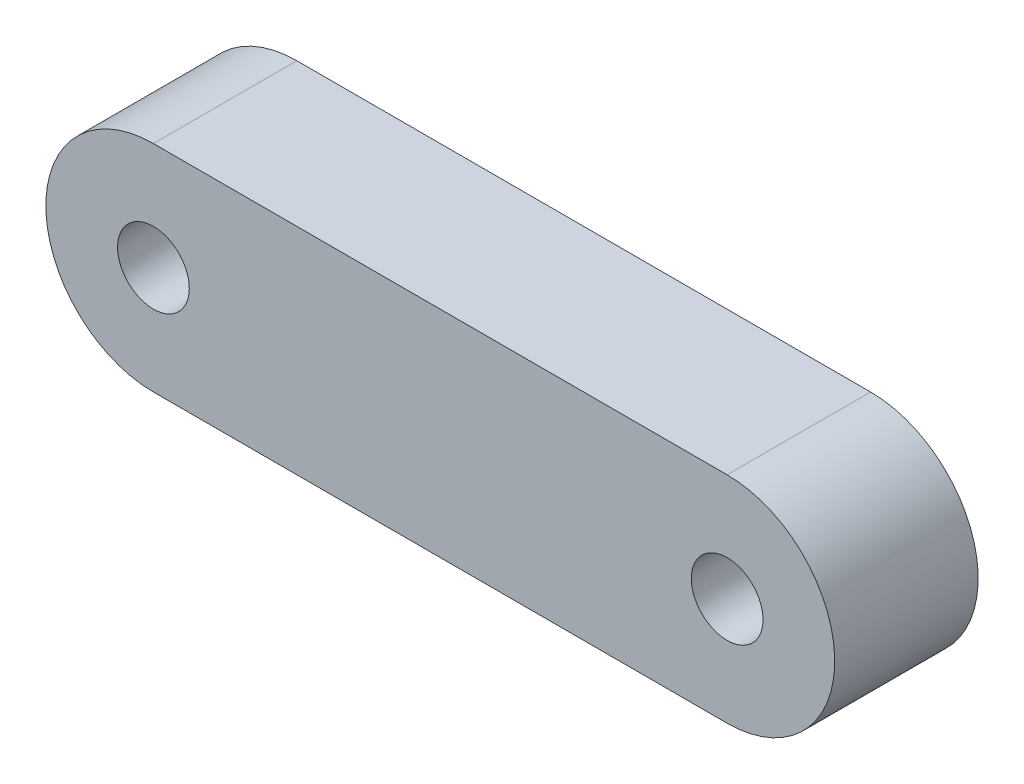
ISO-10303-21;
HEADER;
FILE_DESCRIPTION(('STEP AP214'),'2;1');
FILE_NAME('part.step','',(''),(''),'','','');
FILE_SCHEMA(('AUTOMOTIVE_DESIGN { 1 0 10303 214 1 1 1 1 }'));
ENDSEC;
DATA;
#1=APPLICATION_CONTEXT('core data for automotive mechanical design processes');
#2=APPLICATION_PROTOCOL_DEFINITION('international standard','automotive_design',2000,#1);
#3=PRODUCT_CONTEXT('',#1,'mechanical');
#4=PRODUCT('Part','Part','',(#3));
#5=PRODUCT_RELATED_PRODUCT_CATEGORY('part','',(#4));
#6=PRODUCT_DEFINITION_FORMATION('','',#4);
#7=PRODUCT_DEFINITION_CONTEXT('part definition',#1,'design');
#8=PRODUCT_DEFINITION('design','',#6,#7);
#9=PRODUCT_DEFINITION_SHAPE('','',#8);
#10=(LENGTH_UNIT() NAMED_UNIT(*) SI_UNIT(.MILLI.,.METRE.));
#11=(NAMED_UNIT(*) PLANE_ANGLE_UNIT() SI_UNIT($,.RADIAN.));
#12=(NAMED_UNIT(*) SI_UNIT($,.STERADIAN.) SOLID_ANGLE_UNIT());
#13=UNCERTAINTY_MEASURE_WITH_UNIT(LENGTH_MEASURE(1.E-05),#10,'distance_accuracy_value','');
#14=(GEOMETRIC_REPRESENTATION_CONTEXT(3) GLOBAL_UNCERTAINTY_ASSIGNED_CONTEXT((#13)) GLOBAL_UNIT_ASSIGNED_CONTEXT((#10,
#11,#12)) REPRESENTATION_CONTEXT('',''));
#15=CARTESIAN_POINT('',(0.,0.,0.));
#16=DIRECTION('',(0.,0.,1.));
#17=DIRECTION('',(1.,0.,0.));
#18=AXIS2_PLACEMENT_3D('',#15,#16,#17);
#19=CARTESIAN_POINT('',(0.,0.,20.));
#20=DIRECTION('',(0.,0.,1.));
#21=DIRECTION('',(1.,0.,0.));
#22=AXIS2_PLACEMENT_3D('',#19,#20,#21);
#23=PLANE('',#22);
#24=CARTESIAN_POINT('',(80.,0.,20.));
#25=DIRECTION('',(0.,0.,1.));
#26=DIRECTION('',(1.,0.,0.));
#27=AXIS2_PLACEMENT_3D('',#24,#25,#26);
#28=CIRCLE('',#27,4.99999999999999);
#29=CARTESIAN_POINT('',(85.,0.,20.));
#30=VERTEX_POINT('',#29);
#31=EDGE_CURVE('E103',#30,#30,#28,.T.);
#32=ORIENTED_EDGE('',*,*,#31,.F.);
#33=EDGE_LOOP('',(#32));
#34=FACE_BOUND('',#33,.T.);
#35=CARTESIAN_POINT('',(0.,0.,20.));
#36=DIRECTION('',(0.,0.,1.));
#37=DIRECTION('',(1.,0.,0.));
#38=AXIS2_PLACEMENT_3D('',#35,#36,#37);
#39=CIRCLE('',#38,15.);
#40=CARTESIAN_POINT('',(0.,15.,20.));
#41=VERTEX_POINT('',#40);
#42=CARTESIAN_POINT('',(0.,-15.,20.));
#43=VERTEX_POINT('',#42);
#44=EDGE_CURVE('E88',#41,#43,#39,.T.);
#45=ORIENTED_EDGE('',*,*,#44,.T.);
#46=DIRECTION('',(1.,0.,0.));
#47=VECTOR('',#46,1.);
#48=CARTESIAN_POINT('',(0.,-15.,20.));
#49=LINE('',#48,#47);
#50=CARTESIAN_POINT('',(80.,-15.,20.));
#51=VERTEX_POINT('',#50);
#52=EDGE_CURVE('E83',#43,#51,#49,.T.);
#53=ORIENTED_EDGE('',*,*,#52,.T.);
#54=CARTESIAN_POINT('',(80.,0.,20.));
#55=DIRECTION('',(0.,0.,1.));
#56=DIRECTION('',(1.,0.,0.));
#57=AXIS2_PLACEMENT_3D('',#54,#55,#56);
#58=CIRCLE('',#57,15.);
#59=CARTESIAN_POINT('',(80.,15.,20.));
#60=VERTEX_POINT('',#59);
#61=EDGE_CURVE('E86',#51,#60,#58,.T.);
#62=ORIENTED_EDGE('',*,*,#61,.T.);
#63=DIRECTION('',(-1.,0.,0.));
#64=VECTOR('',#63,1.);
#65=CARTESIAN_POINT('',(0.,15.,20.));
#66=LINE('',#65,#64);
#67=EDGE_CURVE('E53',#60,#41,#66,.T.);
#68=ORIENTED_EDGE('',*,*,#67,.T.);
#69=EDGE_LOOP('',(#45,#53,#62,#68));
#70=FACE_BOUND('',#69,.T.);
#71=CARTESIAN_POINT('',(0.,0.,20.));
#72=DIRECTION('',(0.,0.,1.));
#73=DIRECTION('',(1.,0.,0.));
#74=AXIS2_PLACEMENT_3D('',#71,#72,#73);
#75=CIRCLE('',#74,5.);
#76=CARTESIAN_POINT('',(5.,0.,20.));
#77=VERTEX_POINT('',#76);
#78=EDGE_CURVE('E118',#77,#77,#75,.T.);
#79=ORIENTED_EDGE('',*,*,#78,.F.);
#80=EDGE_LOOP('',(#79));
#81=FACE_BOUND('',#80,.T.);
#82=ADVANCED_FACE('F36',(#34,#70,#81),#23,.T.);
#83=CARTESIAN_POINT('',(0.,0.,0.));
#84=DIRECTION('',(0.,0.,1.));
#85=DIRECTION('',(1.,0.,0.));
#86=AXIS2_PLACEMENT_3D('',#83,#84,#85);
#87=PLANE('',#86);
#88=CARTESIAN_POINT('',(80.,0.,0.));
#89=DIRECTION('',(0.,0.,1.));
#90=DIRECTION('',(1.,0.,0.));
#91=AXIS2_PLACEMENT_3D('',#88,#89,#90);
#92=CIRCLE('',#91,4.99999999999999);
#93=CARTESIAN_POINT('',(85.,0.,0.));
#94=VERTEX_POINT('',#93);
#95=EDGE_CURVE('E115',#94,#94,#92,.T.);
#96=ORIENTED_EDGE('',*,*,#95,.T.);
#97=EDGE_LOOP('',(#96));
#98=FACE_BOUND('',#97,.T.);
#99=CARTESIAN_POINT('',(0.,0.,0.));
#100=DIRECTION('',(0.,0.,1.));
#101=DIRECTION('',(1.,0.,0.));
#102=AXIS2_PLACEMENT_3D('',#99,#100,#101);
#103=CIRCLE('',#102,15.);
#104=CARTESIAN_POINT('',(0.,15.,0.));
#105=VERTEX_POINT('',#104);
#106=CARTESIAN_POINT('',(0.,-15.,0.));
#107=VERTEX_POINT('',#106);
#108=EDGE_CURVE('E100',#105,#107,#103,.T.);
#109=ORIENTED_EDGE('',*,*,#108,.F.);
#110=DIRECTION('',(-1.,0.,0.));
#111=VECTOR('',#110,1.);
#112=CARTESIAN_POINT('',(0.,15.,0.));
#113=LINE('',#112,#111);
#114=CARTESIAN_POINT('',(80.,15.,0.));
#115=VERTEX_POINT('',#114);
#116=EDGE_CURVE('E76',#115,#105,#113,.T.);
#117=ORIENTED_EDGE('',*,*,#116,.F.);
#118=CARTESIAN_POINT('',(80.,0.,0.));
#119=DIRECTION('',(0.,0.,1.));
#120=DIRECTION('',(1.,0.,0.));
#121=AXIS2_PLACEMENT_3D('',#118,#119,#120);
#122=CIRCLE('',#121,15.);
#123=CARTESIAN_POINT('',(80.,-15.,0.));
#124=VERTEX_POINT('',#123);
#125=EDGE_CURVE('E70',#124,#115,#122,.T.);
#126=ORIENTED_EDGE('',*,*,#125,.F.);
#127=DIRECTION('',(1.,0.,0.));
#128=VECTOR('',#127,1.);
#129=CARTESIAN_POINT('',(0.,-15.,0.));
#130=LINE('',#129,#128);
#131=EDGE_CURVE('E92',#107,#124,#130,.T.);
#132=ORIENTED_EDGE('',*,*,#131,.F.);
#133=EDGE_LOOP('',(#109,#117,#126,#132));
#134=FACE_BOUND('',#133,.T.);
#135=CARTESIAN_POINT('',(0.,0.,0.));
#136=DIRECTION('',(0.,0.,1.));
#137=DIRECTION('',(1.,0.,0.));
#138=AXIS2_PLACEMENT_3D('',#135,#136,#137);
#139=CIRCLE('',#138,5.);
#140=CARTESIAN_POINT('',(5.,0.,0.));
#141=VERTEX_POINT('',#140);
#142=EDGE_CURVE('E121',#141,#141,#139,.T.);
#143=ORIENTED_EDGE('',*,*,#142,.T.);
#144=EDGE_LOOP('',(#143));
#145=FACE_BOUND('',#144,.T.);
#146=ADVANCED_FACE('F111',(#98,#134,#145),#87,.F.);
#147=CARTESIAN_POINT('',(0.,0.,20.));
#148=DIRECTION('',(0.,0.,-1.));
#149=DIRECTION('',(-1.,0.,0.));
#150=AXIS2_PLACEMENT_3D('',#147,#148,#149);
#151=CYLINDRICAL_SURFACE('',#150,15.);
#152=ORIENTED_EDGE('',*,*,#108,.T.);
#153=DIRECTION('',(0.,0.,-1.));
#154=VECTOR('',#153,1.);
#155=CARTESIAN_POINT('',(0.,-15.,20.));
#156=LINE('',#155,#154);
#157=EDGE_CURVE('E11',#43,#107,#156,.T.);
#158=ORIENTED_EDGE('',*,*,#157,.F.);
#159=ORIENTED_EDGE('',*,*,#44,.F.);
#160=DIRECTION('',(0.,0.,-1.));
#161=VECTOR('',#160,1.);
#162=CARTESIAN_POINT('',(0.,15.,20.));
#163=LINE('',#162,#161);
#164=EDGE_CURVE('E96',#41,#105,#163,.T.);
#165=ORIENTED_EDGE('',*,*,#164,.T.);
#166=EDGE_LOOP('',(#152,#158,#159,#165));
#167=FACE_BOUND('',#166,.T.);
#168=ADVANCED_FACE('F38',(#167),#151,.T.);
#169=CARTESIAN_POINT('',(0.,-15.,20.));
#170=DIRECTION('',(0.,1.,0.));
#171=DIRECTION('',(0.,0.,1.));
#172=AXIS2_PLACEMENT_3D('',#169,#170,#171);
#173=PLANE('',#172);
#174=ORIENTED_EDGE('',*,*,#131,.T.);
#175=DIRECTION('',(0.,0.,-1.));
#176=VECTOR('',#175,1.);
#177=CARTESIAN_POINT('',(80.,-15.,20.));
#178=LINE('',#177,#176);
#179=EDGE_CURVE('E45',#51,#124,#178,.T.);
#180=ORIENTED_EDGE('',*,*,#179,.F.);
#181=ORIENTED_EDGE('',*,*,#52,.F.);
#182=ORIENTED_EDGE('',*,*,#157,.T.);
#183=EDGE_LOOP('',(#174,#180,#181,#182));
#184=FACE_BOUND('',#183,.T.);
#185=ADVANCED_FACE('F91',(#184),#173,.F.);
#186=CARTESIAN_POINT('',(80.,0.,20.));
#187=DIRECTION('',(0.,0.,-1.));
#188=DIRECTION('',(-1.,0.,0.));
#189=AXIS2_PLACEMENT_3D('',#186,#187,#188);
#190=CYLINDRICAL_SURFACE('',#189,15.);
#191=ORIENTED_EDGE('',*,*,#125,.T.);
#192=DIRECTION('',(0.,0.,-1.));
#193=VECTOR('',#192,1.);
#194=CARTESIAN_POINT('',(80.,15.,20.));
#195=LINE('',#194,#193);
#196=EDGE_CURVE('E93',#60,#115,#195,.T.);
#197=ORIENTED_EDGE('',*,*,#196,.F.);
#198=ORIENTED_EDGE('',*,*,#61,.F.);
#199=ORIENTED_EDGE('',*,*,#179,.T.);
#200=EDGE_LOOP('',(#191,#197,#198,#199));
#201=FACE_BOUND('',#200,.T.);
#202=ADVANCED_FACE('F94',(#201),#190,.T.);
#203=CARTESIAN_POINT('',(0.,15.,20.));
#204=DIRECTION('',(0.,-1.,0.));
#205=DIRECTION('',(0.,0.,-1.));
#206=AXIS2_PLACEMENT_3D('',#203,#204,#205);
#207=PLANE('',#206);
#208=ORIENTED_EDGE('',*,*,#116,.T.);
#209=ORIENTED_EDGE('',*,*,#164,.F.);
#210=ORIENTED_EDGE('',*,*,#67,.F.);
#211=ORIENTED_EDGE('',*,*,#196,.T.);
#212=EDGE_LOOP('',(#208,#209,#210,#211));
#213=FACE_BOUND('',#212,.T.);
#214=ADVANCED_FACE('F108',(#213),#207,.F.);
#215=CARTESIAN_POINT('',(80.,0.,20.));
#216=DIRECTION('',(0.,0.,-1.));
#217=DIRECTION('',(-1.,0.,0.));
#218=AXIS2_PLACEMENT_3D('',#215,#216,#217);
#219=CYLINDRICAL_SURFACE('',#218,4.99999999999999);
#220=ORIENTED_EDGE('',*,*,#31,.T.);
#221=EDGE_LOOP('',(#220));
#222=FACE_BOUND('',#221,.T.);
#223=ORIENTED_EDGE('',*,*,#95,.F.);
#224=EDGE_LOOP('',(#223));
#225=FACE_BOUND('',#224,.T.);
#226=ADVANCED_FACE('F139',(#222,#225),#219,.F.);
#227=CARTESIAN_POINT('',(0.,0.,20.));
#228=DIRECTION('',(0.,0.,-1.));
#229=DIRECTION('',(-1.,0.,0.));
#230=AXIS2_PLACEMENT_3D('',#227,#228,#229);
#231=CYLINDRICAL_SURFACE('',#230,5.);
#232=ORIENTED_EDGE('',*,*,#78,.T.);
#233=EDGE_LOOP('',(#232));
#234=FACE_BOUND('',#233,.T.);
#235=ORIENTED_EDGE('',*,*,#142,.F.);
#236=EDGE_LOOP('',(#235));
#237=FACE_BOUND('',#236,.T.);
#238=ADVANCED_FACE('F127',(#234,#237),#231,.F.);
#239=CLOSED_SHELL('',(#82,#146,#168,#185,#202,#214,#226,#238));
#240=MANIFOLD_SOLID_BREP('B2',#239);
#241=ADVANCED_BREP_SHAPE_REPRESENTATION('',(#18,#240),#14);
#242=SHAPE_DEFINITION_REPRESENTATION(#9,#241);
ENDSEC;
END-ISO-10303-21;
